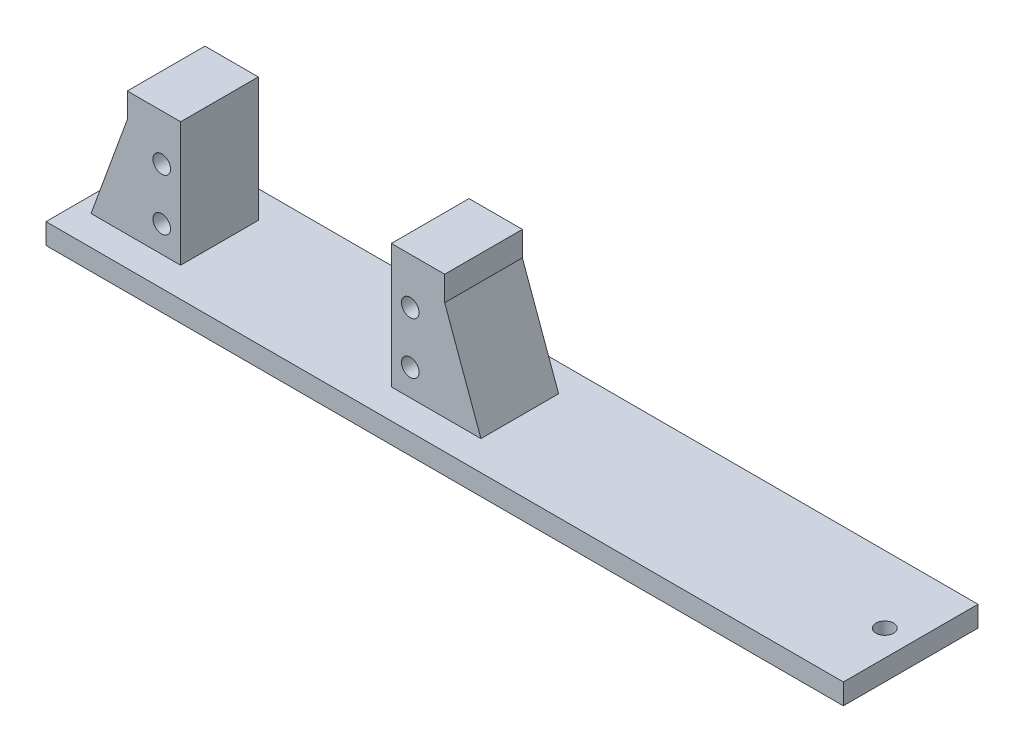
ISO-10303-21;
HEADER;
FILE_DESCRIPTION(('STEP AP214'),'2;1');
FILE_NAME('part.step','',(''),(''),'','','');
FILE_SCHEMA(('AUTOMOTIVE_DESIGN { 1 0 10303 214 1 1 1 1 }'));
ENDSEC;
DATA;
#1=APPLICATION_CONTEXT('core data for automotive mechanical design processes');
#2=APPLICATION_PROTOCOL_DEFINITION('international standard','automotive_design',2000,#1);
#3=PRODUCT_CONTEXT('',#1,'mechanical');
#4=PRODUCT('Part','Part','',(#3));
#5=PRODUCT_RELATED_PRODUCT_CATEGORY('part','',(#4));
#6=PRODUCT_DEFINITION_FORMATION('','',#4);
#7=PRODUCT_DEFINITION_CONTEXT('part definition',#1,'design');
#8=PRODUCT_DEFINITION('design','',#6,#7);
#9=PRODUCT_DEFINITION_SHAPE('','',#8);
#10=(LENGTH_UNIT() NAMED_UNIT(*) SI_UNIT(.MILLI.,.METRE.));
#11=(NAMED_UNIT(*) PLANE_ANGLE_UNIT() SI_UNIT($,.RADIAN.));
#12=(NAMED_UNIT(*) SI_UNIT($,.STERADIAN.) SOLID_ANGLE_UNIT());
#13=UNCERTAINTY_MEASURE_WITH_UNIT(LENGTH_MEASURE(1.E-05),#10,'distance_accuracy_value','');
#14=(GEOMETRIC_REPRESENTATION_CONTEXT(3) GLOBAL_UNCERTAINTY_ASSIGNED_CONTEXT((#13)) GLOBAL_UNIT_ASSIGNED_CONTEXT((#10,
#11,#12)) REPRESENTATION_CONTEXT('',''));
#15=CARTESIAN_POINT('',(0.,0.,0.));
#16=DIRECTION('',(0.,0.,1.));
#17=DIRECTION('',(1.,0.,0.));
#18=AXIS2_PLACEMENT_3D('',#15,#16,#17);
#19=CARTESIAN_POINT('',(-67.,23.2323419361827,-73.7));
#20=DIRECTION('',(-0.939692620785911,0.342020143325662,0.));
#21=DIRECTION('',(0.,0.,-1.));
#22=AXIS2_PLACEMENT_3D('',#19,#20,#21);
#23=PLANE('',#22);
#24=DIRECTION('',(0.,0.,-1.));
#25=VECTOR('',#24,1.);
#26=CARTESIAN_POINT('',(-74.,4.,-73.7));
#27=LINE('',#26,#25);
#28=CARTESIAN_POINT('',(-74.,4.,-71.));
#29=VERTEX_POINT('',#28);
#30=CARTESIAN_POINT('',(-74.,4.,-73.7));
#31=VERTEX_POINT('',#30);
#32=EDGE_CURVE('E298',#29,#31,#27,.T.);
#33=ORIENTED_EDGE('',*,*,#32,.F.);
#34=DIRECTION('',(-0.342020143325662,-0.939692620785911,0.));
#35=VECTOR('',#34,1.);
#36=CARTESIAN_POINT('',(-67.,23.2323419361827,-71.));
#37=LINE('',#36,#35);
#38=CARTESIAN_POINT('',(-67.,23.2323419361827,-71.));
#39=VERTEX_POINT('',#38);
#40=EDGE_CURVE('E11',#29,#39,#37,.F.);
#41=ORIENTED_EDGE('',*,*,#40,.T.);
#42=DIRECTION('',(0.,0.,1.));
#43=VECTOR('',#42,1.);
#44=CARTESIAN_POINT('',(-67.,23.2323419361827,-58.7));
#45=LINE('',#44,#43);
#46=CARTESIAN_POINT('',(-67.,23.2323419361827,-73.7));
#47=VERTEX_POINT('',#46);
#48=EDGE_CURVE('E296',#47,#39,#45,.T.);
#49=ORIENTED_EDGE('',*,*,#48,.F.);
#50=DIRECTION('',(-0.342020143325662,-0.939692620785911,0.));
#51=VECTOR('',#50,1.);
#52=CARTESIAN_POINT('',(-65.4677042346781,27.4422899513307,-73.7));
#53=LINE('',#52,#51);
#54=EDGE_CURVE('E302',#31,#47,#53,.F.);
#55=ORIENTED_EDGE('',*,*,#54,.F.);
#56=EDGE_LOOP('',(#33,#41,#49,#55));
#57=FACE_BOUND('',#56,.T.);
#58=ADVANCED_FACE('F43',(#57),#23,.T.);
#59=CARTESIAN_POINT('',(0.,4.,0.));
#60=DIRECTION('',(0.,-1.,0.));
#61=DIRECTION('',(0.,0.,-1.));
#62=AXIS2_PLACEMENT_3D('',#59,#60,#61);
#63=PLANE('',#62);
#64=DIRECTION('',(-1.,0.,0.));
#65=VECTOR('',#64,1.);
#66=CARTESIAN_POINT('',(-77.,4.,-71.));
#67=LINE('',#66,#65);
#68=CARTESIAN_POINT('',(-67.,4.,-71.));
#69=VERTEX_POINT('',#68);
#70=EDGE_CURVE('E173',#69,#29,#67,.T.);
#71=ORIENTED_EDGE('',*,*,#70,.T.);
#72=ORIENTED_EDGE('',*,*,#32,.T.);
#73=DIRECTION('',(-1.,0.,0.));
#74=VECTOR('',#73,1.);
#75=CARTESIAN_POINT('',(-67.,4.,-73.7));
#76=LINE('',#75,#74);
#77=CARTESIAN_POINT('',(-56.7,4.,-73.7));
#78=VERTEX_POINT('',#77);
#79=EDGE_CURVE('E231',#78,#31,#76,.T.);
#80=ORIENTED_EDGE('',*,*,#79,.F.);
#81=DIRECTION('',(0.,0.,-1.));
#82=VECTOR('',#81,1.);
#83=CARTESIAN_POINT('',(-56.7,4.,-73.7));
#84=LINE('',#83,#82);
#85=CARTESIAN_POINT('',(-56.7,4.,-58.7));
#86=VERTEX_POINT('',#85);
#87=EDGE_CURVE('E234',#86,#78,#84,.T.);
#88=ORIENTED_EDGE('',*,*,#87,.F.);
#89=DIRECTION('',(1.,0.,0.));
#90=VECTOR('',#89,1.);
#91=CARTESIAN_POINT('',(-67.,4.,-58.7));
#92=LINE('',#91,#90);
#93=CARTESIAN_POINT('',(-74.,4.,-58.7));
#94=VERTEX_POINT('',#93);
#95=EDGE_CURVE('E67',#94,#86,#92,.T.);
#96=ORIENTED_EDGE('',*,*,#95,.F.);
#97=CARTESIAN_POINT('',(-74.,3.99999999999999,-61.));
#98=VERTEX_POINT('',#97);
#99=EDGE_CURVE('E170',#94,#98,#27,.T.);
#100=ORIENTED_EDGE('',*,*,#99,.T.);
#101=DIRECTION('',(1.,0.,0.));
#102=VECTOR('',#101,1.);
#103=CARTESIAN_POINT('',(-77.,4.,-61.));
#104=LINE('',#103,#102);
#105=CARTESIAN_POINT('',(-67.,4.,-61.));
#106=VERTEX_POINT('',#105);
#107=EDGE_CURVE('E163',#98,#106,#104,.T.);
#108=ORIENTED_EDGE('',*,*,#107,.T.);
#109=DIRECTION('',(0.,0.,-1.));
#110=VECTOR('',#109,1.);
#111=CARTESIAN_POINT('',(-67.,4.,-71.));
#112=LINE('',#111,#110);
#113=EDGE_CURVE('E167',#106,#69,#112,.T.);
#114=ORIENTED_EDGE('',*,*,#113,.T.);
#115=EDGE_LOOP('',(#71,#72,#80,#88,#96,#100,#108,#114));
#116=FACE_BOUND('',#115,.T.);
#117=DIRECTION('',(0.,0.,1.));
#118=VECTOR('',#117,1.);
#119=CARTESIAN_POINT('',(-77.,4.,-79.));
#120=LINE('',#119,#118);
#121=CARTESIAN_POINT('',(-77.,4.,-79.));
#122=VERTEX_POINT('',#121);
#123=CARTESIAN_POINT('',(-77.,4.,-53.));
#124=VERTEX_POINT('',#123);
#125=EDGE_CURVE('E263',#122,#124,#120,.T.);
#126=ORIENTED_EDGE('',*,*,#125,.T.);
#127=DIRECTION('',(1.,0.,0.));
#128=VECTOR('',#127,1.);
#129=CARTESIAN_POINT('',(-77.,4.,-53.));
#130=LINE('',#129,#128);
#131=CARTESIAN_POINT('',(77.,4.,-53.));
#132=VERTEX_POINT('',#131);
#133=EDGE_CURVE('E255',#124,#132,#130,.T.);
#134=ORIENTED_EDGE('',*,*,#133,.T.);
#135=DIRECTION('',(0.,0.,-1.));
#136=VECTOR('',#135,1.);
#137=CARTESIAN_POINT('',(77.,4.,-79.));
#138=LINE('',#137,#136);
#139=CARTESIAN_POINT('',(77.,4.,-79.));
#140=VERTEX_POINT('',#139);
#141=EDGE_CURVE('E258',#132,#140,#138,.T.);
#142=ORIENTED_EDGE('',*,*,#141,.T.);
#143=DIRECTION('',(-1.,0.,0.));
#144=VECTOR('',#143,1.);
#145=CARTESIAN_POINT('',(-77.,4.,-79.));
#146=LINE('',#145,#144);
#147=EDGE_CURVE('E261',#140,#122,#146,.T.);
#148=ORIENTED_EDGE('',*,*,#147,.T.);
#149=EDGE_LOOP('',(#126,#134,#142,#148));
#150=FACE_BOUND('',#149,.T.);
#151=CARTESIAN_POINT('',(72.,4.,-66.));
#152=DIRECTION('',(0.,1.,0.));
#153=DIRECTION('',(0.,0.,1.));
#154=AXIS2_PLACEMENT_3D('',#151,#152,#153);
#155=CIRCLE('',#154,1.7);
#156=CARTESIAN_POINT('',(72.,4.,-64.3));
#157=VERTEX_POINT('',#156);
#158=EDGE_CURVE('E249',#157,#157,#155,.T.);
#159=ORIENTED_EDGE('',*,*,#158,.F.);
#160=EDGE_LOOP('',(#159));
#161=FACE_BOUND('',#160,.T.);
#162=DIRECTION('',(-1.,0.,0.));
#163=VECTOR('',#162,1.);
#164=CARTESIAN_POINT('',(-16.,4.,-73.7));
#165=LINE('',#164,#163);
#166=CARTESIAN_POINT('',(1.29999999999999,4.,-73.7));
#167=VERTEX_POINT('',#166);
#168=CARTESIAN_POINT('',(-16.,4.,-73.7));
#169=VERTEX_POINT('',#168);
#170=EDGE_CURVE('E202',#167,#169,#165,.T.);
#171=ORIENTED_EDGE('',*,*,#170,.F.);
#172=DIRECTION('',(0.,0.,1.));
#173=VECTOR('',#172,1.);
#174=CARTESIAN_POINT('',(1.3,4.,-58.7));
#175=LINE('',#174,#173);
#176=CARTESIAN_POINT('',(1.3,4.,-58.7));
#177=VERTEX_POINT('',#176);
#178=EDGE_CURVE('E287',#167,#177,#175,.T.);
#179=ORIENTED_EDGE('',*,*,#178,.T.);
#180=DIRECTION('',(1.,0.,0.));
#181=VECTOR('',#180,1.);
#182=CARTESIAN_POINT('',(-16.,4.,-58.7));
#183=LINE('',#182,#181);
#184=CARTESIAN_POINT('',(-16.,4.,-58.7));
#185=VERTEX_POINT('',#184);
#186=EDGE_CURVE('E200',#185,#177,#183,.T.);
#187=ORIENTED_EDGE('',*,*,#186,.F.);
#188=DIRECTION('',(0.,0.,1.));
#189=VECTOR('',#188,1.);
#190=CARTESIAN_POINT('',(-16.,4.,-73.7));
#191=LINE('',#190,#189);
#192=EDGE_CURVE('E193',#169,#185,#191,.T.);
#193=ORIENTED_EDGE('',*,*,#192,.F.);
#194=EDGE_LOOP('',(#171,#179,#187,#193));
#195=FACE_BOUND('',#194,.T.);
#196=CARTESIAN_POINT('',(-72.,4.,-66.));
#197=DIRECTION('',(0.,-1.,0.));
#198=DIRECTION('',(0.,0.,-1.));
#199=AXIS2_PLACEMENT_3D('',#196,#197,#198);
#200=CIRCLE('',#199,1.7);
#201=CARTESIAN_POINT('',(-72.,4.,-67.7));
#202=VERTEX_POINT('',#201);
#203=EDGE_CURVE('E185',#202,#202,#200,.T.);
#204=ORIENTED_EDGE('',*,*,#203,.T.);
#205=EDGE_LOOP('',(#204));
#206=FACE_BOUND('',#205,.T.);
#207=ADVANCED_FACE('F165',(#116,#150,#161,#195,#206),#63,.F.);
#208=CARTESIAN_POINT('',(0.,0.,0.));
#209=DIRECTION('',(0.,-1.,0.));
#210=DIRECTION('',(0.,0.,-1.));
#211=AXIS2_PLACEMENT_3D('',#208,#209,#210);
#212=PLANE('',#211);
#213=CARTESIAN_POINT('',(72.,0.,-66.));
#214=DIRECTION('',(0.,1.,0.));
#215=DIRECTION('',(0.,0.,1.));
#216=AXIS2_PLACEMENT_3D('',#213,#214,#215);
#217=CIRCLE('',#216,1.7);
#218=CARTESIAN_POINT('',(72.,0.,-64.3));
#219=VERTEX_POINT('',#218);
#220=EDGE_CURVE('E248',#219,#219,#217,.T.);
#221=ORIENTED_EDGE('',*,*,#220,.T.);
#222=EDGE_LOOP('',(#221));
#223=FACE_BOUND('',#222,.T.);
#224=DIRECTION('',(1.,0.,0.));
#225=VECTOR('',#224,1.);
#226=CARTESIAN_POINT('',(-77.,0.,-53.));
#227=LINE('',#226,#225);
#228=CARTESIAN_POINT('',(-77.,0.,-53.));
#229=VERTEX_POINT('',#228);
#230=CARTESIAN_POINT('',(77.,0.,-53.));
#231=VERTEX_POINT('',#230);
#232=EDGE_CURVE('E252',#229,#231,#227,.T.);
#233=ORIENTED_EDGE('',*,*,#232,.F.);
#234=DIRECTION('',(0.,0.,1.));
#235=VECTOR('',#234,1.);
#236=CARTESIAN_POINT('',(-77.,0.,-79.));
#237=LINE('',#236,#235);
#238=CARTESIAN_POINT('',(-77.,0.,-79.));
#239=VERTEX_POINT('',#238);
#240=EDGE_CURVE('E259',#239,#229,#237,.T.);
#241=ORIENTED_EDGE('',*,*,#240,.F.);
#242=DIRECTION('',(-1.,0.,0.));
#243=VECTOR('',#242,1.);
#244=CARTESIAN_POINT('',(-77.,0.,-79.));
#245=LINE('',#244,#243);
#246=CARTESIAN_POINT('',(77.,0.,-79.));
#247=VERTEX_POINT('',#246);
#248=EDGE_CURVE('E270',#247,#239,#245,.T.);
#249=ORIENTED_EDGE('',*,*,#248,.F.);
#250=DIRECTION('',(0.,0.,-1.));
#251=VECTOR('',#250,1.);
#252=CARTESIAN_POINT('',(77.,0.,-79.));
#253=LINE('',#252,#251);
#254=EDGE_CURVE('E268',#231,#247,#253,.T.);
#255=ORIENTED_EDGE('',*,*,#254,.F.);
#256=EDGE_LOOP('',(#233,#241,#249,#255));
#257=FACE_BOUND('',#256,.T.);
#258=CARTESIAN_POINT('',(-72.,0.,-66.));
#259=DIRECTION('',(0.,1.,0.));
#260=DIRECTION('',(0.,0.,1.));
#261=AXIS2_PLACEMENT_3D('',#258,#259,#260);
#262=CIRCLE('',#261,1.7);
#263=CARTESIAN_POINT('',(-72.,0.,-64.3));
#264=VERTEX_POINT('',#263);
#265=EDGE_CURVE('E218',#264,#264,#262,.T.);
#266=ORIENTED_EDGE('',*,*,#265,.T.);
#267=EDGE_LOOP('',(#266));
#268=FACE_BOUND('',#267,.T.);
#269=ADVANCED_FACE('F398',(#223,#257,#268),#212,.T.);
#270=CARTESIAN_POINT('',(-77.,4.,-53.));
#271=DIRECTION('',(0.,0.,-1.));
#272=DIRECTION('',(-1.,0.,0.));
#273=AXIS2_PLACEMENT_3D('',#270,#271,#272);
#274=PLANE('',#273);
#275=ORIENTED_EDGE('',*,*,#232,.T.);
#276=DIRECTION('',(0.,-1.,0.));
#277=VECTOR('',#276,1.);
#278=CARTESIAN_POINT('',(77.,4.,-53.));
#279=LINE('',#278,#277);
#280=EDGE_CURVE('E281',#132,#231,#279,.T.);
#281=ORIENTED_EDGE('',*,*,#280,.F.);
#282=ORIENTED_EDGE('',*,*,#133,.F.);
#283=DIRECTION('',(0.,-1.,0.));
#284=VECTOR('',#283,1.);
#285=CARTESIAN_POINT('',(-77.,4.,-53.));
#286=LINE('',#285,#284);
#287=EDGE_CURVE('E265',#124,#229,#286,.T.);
#288=ORIENTED_EDGE('',*,*,#287,.T.);
#289=EDGE_LOOP('',(#275,#281,#282,#288));
#290=FACE_BOUND('',#289,.T.);
#291=ADVANCED_FACE('F413',(#290),#274,.F.);
#292=CARTESIAN_POINT('',(77.,4.,-79.));
#293=DIRECTION('',(-1.,0.,0.));
#294=DIRECTION('',(0.,0.,1.));
#295=AXIS2_PLACEMENT_3D('',#292,#293,#294);
#296=PLANE('',#295);
#297=ORIENTED_EDGE('',*,*,#254,.T.);
#298=DIRECTION('',(0.,-1.,0.));
#299=VECTOR('',#298,1.);
#300=CARTESIAN_POINT('',(77.,4.,-79.));
#301=LINE('',#300,#299);
#302=EDGE_CURVE('E278',#140,#247,#301,.T.);
#303=ORIENTED_EDGE('',*,*,#302,.F.);
#304=ORIENTED_EDGE('',*,*,#141,.F.);
#305=ORIENTED_EDGE('',*,*,#280,.T.);
#306=EDGE_LOOP('',(#297,#303,#304,#305));
#307=FACE_BOUND('',#306,.T.);
#308=ADVANCED_FACE('F416',(#307),#296,.F.);
#309=CARTESIAN_POINT('',(-77.,4.,-79.));
#310=DIRECTION('',(0.,0.,1.));
#311=DIRECTION('',(1.,0.,0.));
#312=AXIS2_PLACEMENT_3D('',#309,#310,#311);
#313=PLANE('',#312);
#314=ORIENTED_EDGE('',*,*,#248,.T.);
#315=DIRECTION('',(0.,-1.,0.));
#316=VECTOR('',#315,1.);
#317=CARTESIAN_POINT('',(-77.,4.,-79.));
#318=LINE('',#317,#316);
#319=EDGE_CURVE('E275',#122,#239,#318,.T.);
#320=ORIENTED_EDGE('',*,*,#319,.F.);
#321=ORIENTED_EDGE('',*,*,#147,.F.);
#322=ORIENTED_EDGE('',*,*,#302,.T.);
#323=EDGE_LOOP('',(#314,#320,#321,#322));
#324=FACE_BOUND('',#323,.T.);
#325=ADVANCED_FACE('F420',(#324),#313,.F.);
#326=CARTESIAN_POINT('',(-77.,4.,-79.));
#327=DIRECTION('',(1.,0.,0.));
#328=DIRECTION('',(0.,0.,-1.));
#329=AXIS2_PLACEMENT_3D('',#326,#327,#328);
#330=PLANE('',#329);
#331=ORIENTED_EDGE('',*,*,#240,.T.);
#332=ORIENTED_EDGE('',*,*,#287,.F.);
#333=ORIENTED_EDGE('',*,*,#125,.F.);
#334=ORIENTED_EDGE('',*,*,#319,.T.);
#335=EDGE_LOOP('',(#331,#332,#333,#334));
#336=FACE_BOUND('',#335,.T.);
#337=ADVANCED_FACE('F424',(#336),#330,.F.);
#338=CARTESIAN_POINT('',(72.,4.,-66.));
#339=DIRECTION('',(0.,-1.,0.));
#340=DIRECTION('',(0.,0.,-1.));
#341=AXIS2_PLACEMENT_3D('',#338,#339,#340);
#342=CYLINDRICAL_SURFACE('',#341,1.7);
#343=ORIENTED_EDGE('',*,*,#158,.T.);
#344=EDGE_LOOP('',(#343));
#345=FACE_BOUND('',#344,.T.);
#346=ORIENTED_EDGE('',*,*,#220,.F.);
#347=EDGE_LOOP('',(#346));
#348=FACE_BOUND('',#347,.T.);
#349=ADVANCED_FACE('F428',(#345,#348),#342,.F.);
#350=CARTESIAN_POINT('',(-72.,4.,-66.));
#351=DIRECTION('',(0.,-1.,0.));
#352=DIRECTION('',(0.,0.,-1.));
#353=AXIS2_PLACEMENT_3D('',#350,#351,#352);
#354=CYLINDRICAL_SURFACE('',#353,1.7);
#355=ORIENTED_EDGE('',*,*,#203,.F.);
#356=EDGE_LOOP('',(#355));
#357=FACE_BOUND('',#356,.T.);
#358=ORIENTED_EDGE('',*,*,#265,.F.);
#359=EDGE_LOOP('',(#358));
#360=FACE_BOUND('',#359,.T.);
#361=ADVANCED_FACE('F435',(#357,#360),#354,.F.);
#362=CARTESIAN_POINT('',(-67.,28.,-58.7));
#363=DIRECTION('',(0.,0.,-1.));
#364=DIRECTION('',(-1.,0.,0.));
#365=AXIS2_PLACEMENT_3D('',#362,#363,#364);
#366=PLANE('',#365);
#367=CARTESIAN_POINT('',(-60.35,19.1,-58.7));
#368=DIRECTION('',(0.,0.,1.));
#369=DIRECTION('',(1.,0.,0.));
#370=AXIS2_PLACEMENT_3D('',#367,#368,#369);
#371=CIRCLE('',#370,1.7);
#372=CARTESIAN_POINT('',(-58.65,19.1,-58.7));
#373=VERTEX_POINT('',#372);
#374=EDGE_CURVE('E331',#373,#373,#371,.T.);
#375=ORIENTED_EDGE('',*,*,#374,.F.);
#376=EDGE_LOOP('',(#375));
#377=FACE_BOUND('',#376,.T.);
#378=CARTESIAN_POINT('',(-60.35,9.09999999999999,-58.7));
#379=DIRECTION('',(0.,0.,1.));
#380=DIRECTION('',(1.,0.,0.));
#381=AXIS2_PLACEMENT_3D('',#378,#379,#380);
#382=CIRCLE('',#381,1.7);
#383=CARTESIAN_POINT('',(-58.65,9.09999999999999,-58.7));
#384=VERTEX_POINT('',#383);
#385=EDGE_CURVE('E326',#384,#384,#382,.T.);
#386=ORIENTED_EDGE('',*,*,#385,.F.);
#387=EDGE_LOOP('',(#386));
#388=FACE_BOUND('',#387,.T.);
#389=ORIENTED_EDGE('',*,*,#95,.T.);
#390=DIRECTION('',(0.,-1.,0.));
#391=VECTOR('',#390,1.);
#392=CARTESIAN_POINT('',(-56.7,28.,-58.7));
#393=LINE('',#392,#391);
#394=CARTESIAN_POINT('',(-56.7,28.,-58.7));
#395=VERTEX_POINT('',#394);
#396=EDGE_CURVE('E188',#395,#86,#393,.T.);
#397=ORIENTED_EDGE('',*,*,#396,.F.);
#398=DIRECTION('',(1.,0.,0.));
#399=VECTOR('',#398,1.);
#400=CARTESIAN_POINT('',(-67.,28.,-58.7));
#401=LINE('',#400,#399);
#402=CARTESIAN_POINT('',(-67.,28.,-58.7));
#403=VERTEX_POINT('',#402);
#404=EDGE_CURVE('E235',#403,#395,#401,.T.);
#405=ORIENTED_EDGE('',*,*,#404,.F.);
#406=DIRECTION('',(0.,-1.,0.));
#407=VECTOR('',#406,1.);
#408=CARTESIAN_POINT('',(-67.,28.,-58.7));
#409=LINE('',#408,#407);
#410=CARTESIAN_POINT('',(-67.,23.2323419361827,-58.7));
#411=VERTEX_POINT('',#410);
#412=EDGE_CURVE('E227',#403,#411,#409,.T.);
#413=ORIENTED_EDGE('',*,*,#412,.T.);
#414=DIRECTION('',(0.342020143325662,0.939692620785911,0.));
#415=VECTOR('',#414,1.);
#416=CARTESIAN_POINT('',(-65.4677042346781,27.4422899513307,-58.7));
#417=LINE('',#416,#415);
#418=EDGE_CURVE('E300',#411,#94,#417,.F.);
#419=ORIENTED_EDGE('',*,*,#418,.T.);
#420=EDGE_LOOP('',(#389,#397,#405,#413,#419));
#421=FACE_BOUND('',#420,.T.);
#422=ADVANCED_FACE('F309',(#377,#388,#421),#366,.F.);
#423=CARTESIAN_POINT('',(-56.7,28.,-73.7));
#424=DIRECTION('',(-1.,0.,0.));
#425=DIRECTION('',(0.,0.,1.));
#426=AXIS2_PLACEMENT_3D('',#423,#424,#425);
#427=PLANE('',#426);
#428=ORIENTED_EDGE('',*,*,#87,.T.);
#429=DIRECTION('',(0.,-1.,0.));
#430=VECTOR('',#429,1.);
#431=CARTESIAN_POINT('',(-56.7,28.,-73.7));
#432=LINE('',#431,#430);
#433=CARTESIAN_POINT('',(-56.7,28.,-73.7));
#434=VERTEX_POINT('',#433);
#435=EDGE_CURVE('E221',#434,#78,#432,.T.);
#436=ORIENTED_EDGE('',*,*,#435,.F.);
#437=DIRECTION('',(0.,0.,-1.));
#438=VECTOR('',#437,1.);
#439=CARTESIAN_POINT('',(-56.7,28.,-73.7));
#440=LINE('',#439,#438);
#441=EDGE_CURVE('E242',#395,#434,#440,.T.);
#442=ORIENTED_EDGE('',*,*,#441,.F.);
#443=ORIENTED_EDGE('',*,*,#396,.T.);
#444=EDGE_LOOP('',(#428,#436,#442,#443));
#445=FACE_BOUND('',#444,.T.);
#446=ADVANCED_FACE('F443',(#445),#427,.F.);
#447=CARTESIAN_POINT('',(-67.,28.,-73.7));
#448=DIRECTION('',(0.,0.,1.));
#449=DIRECTION('',(1.,0.,0.));
#450=AXIS2_PLACEMENT_3D('',#447,#448,#449);
#451=PLANE('',#450);
#452=CARTESIAN_POINT('',(-60.35,19.1,-73.7));
#453=DIRECTION('',(0.,0.,1.));
#454=DIRECTION('',(1.,0.,0.));
#455=AXIS2_PLACEMENT_3D('',#452,#453,#454);
#456=CIRCLE('',#455,1.7);
#457=CARTESIAN_POINT('',(-58.65,19.1,-73.7));
#458=VERTEX_POINT('',#457);
#459=EDGE_CURVE('E335',#458,#458,#456,.F.);
#460=ORIENTED_EDGE('',*,*,#459,.F.);
#461=EDGE_LOOP('',(#460));
#462=FACE_BOUND('',#461,.T.);
#463=CARTESIAN_POINT('',(-60.35,9.09999999999999,-73.7));
#464=DIRECTION('',(0.,0.,1.));
#465=DIRECTION('',(1.,0.,0.));
#466=AXIS2_PLACEMENT_3D('',#463,#464,#465);
#467=CIRCLE('',#466,1.7);
#468=CARTESIAN_POINT('',(-58.65,9.09999999999999,-73.7));
#469=VERTEX_POINT('',#468);
#470=EDGE_CURVE('E323',#469,#469,#467,.F.);
#471=ORIENTED_EDGE('',*,*,#470,.F.);
#472=EDGE_LOOP('',(#471));
#473=FACE_BOUND('',#472,.T.);
#474=ORIENTED_EDGE('',*,*,#79,.T.);
#475=ORIENTED_EDGE('',*,*,#54,.T.);
#476=DIRECTION('',(0.,-1.,0.));
#477=VECTOR('',#476,1.);
#478=CARTESIAN_POINT('',(-67.,28.,-73.7));
#479=LINE('',#478,#477);
#480=CARTESIAN_POINT('',(-67.,28.,-73.7));
#481=VERTEX_POINT('',#480);
#482=EDGE_CURVE('E224',#481,#47,#479,.T.);
#483=ORIENTED_EDGE('',*,*,#482,.F.);
#484=DIRECTION('',(-1.,0.,0.));
#485=VECTOR('',#484,1.);
#486=CARTESIAN_POINT('',(-67.,28.,-73.7));
#487=LINE('',#486,#485);
#488=EDGE_CURVE('E240',#434,#481,#487,.T.);
#489=ORIENTED_EDGE('',*,*,#488,.F.);
#490=ORIENTED_EDGE('',*,*,#435,.T.);
#491=EDGE_LOOP('',(#474,#475,#483,#489,#490));
#492=FACE_BOUND('',#491,.T.);
#493=ADVANCED_FACE('F316',(#462,#473,#492),#451,.F.);
#494=CARTESIAN_POINT('',(-67.,28.,-73.7));
#495=DIRECTION('',(1.,0.,0.));
#496=DIRECTION('',(0.,0.,-1.));
#497=AXIS2_PLACEMENT_3D('',#494,#495,#496);
#498=PLANE('',#497);
#499=ORIENTED_EDGE('',*,*,#412,.F.);
#500=DIRECTION('',(0.,0.,1.));
#501=VECTOR('',#500,1.);
#502=CARTESIAN_POINT('',(-67.,28.,-73.7));
#503=LINE('',#502,#501);
#504=EDGE_CURVE('E230',#481,#403,#503,.T.);
#505=ORIENTED_EDGE('',*,*,#504,.F.);
#506=ORIENTED_EDGE('',*,*,#482,.T.);
#507=ORIENTED_EDGE('',*,*,#48,.T.);
#508=DIRECTION('',(0.,1.,0.));
#509=VECTOR('',#508,1.);
#510=CARTESIAN_POINT('',(-67.,-10.1421356237309,-71.));
#511=LINE('',#510,#509);
#512=EDGE_CURVE('E178',#69,#39,#511,.T.);
#513=ORIENTED_EDGE('',*,*,#512,.F.);
#514=ORIENTED_EDGE('',*,*,#113,.F.);
#515=DIRECTION('',(0.,1.,0.));
#516=VECTOR('',#515,1.);
#517=CARTESIAN_POINT('',(-67.,-10.1421356237309,-61.));
#518=LINE('',#517,#516);
#519=CARTESIAN_POINT('',(-67.,23.2323419361827,-61.));
#520=VERTEX_POINT('',#519);
#521=EDGE_CURVE('E59',#106,#520,#518,.T.);
#522=ORIENTED_EDGE('',*,*,#521,.T.);
#523=EDGE_CURVE('E295',#520,#411,#45,.T.);
#524=ORIENTED_EDGE('',*,*,#523,.T.);
#525=EDGE_LOOP('',(#499,#505,#506,#507,#513,#514,#522,#524));
#526=FACE_BOUND('',#525,.T.);
#527=ADVANCED_FACE('F176',(#526),#498,.F.);
#528=CARTESIAN_POINT('',(0.,28.,0.));
#529=DIRECTION('',(0.,-1.,0.));
#530=DIRECTION('',(0.,0.,-1.));
#531=AXIS2_PLACEMENT_3D('',#528,#529,#530);
#532=PLANE('',#531);
#533=ORIENTED_EDGE('',*,*,#404,.T.);
#534=ORIENTED_EDGE('',*,*,#441,.T.);
#535=ORIENTED_EDGE('',*,*,#488,.T.);
#536=ORIENTED_EDGE('',*,*,#504,.T.);
#537=EDGE_LOOP('',(#533,#534,#535,#536));
#538=FACE_BOUND('',#537,.T.);
#539=ADVANCED_FACE('F311',(#538),#532,.F.);
#540=CARTESIAN_POINT('',(-16.,28.,-58.7));
#541=DIRECTION('',(0.,0.,-1.));
#542=DIRECTION('',(-1.,0.,0.));
#543=AXIS2_PLACEMENT_3D('',#540,#541,#542);
#544=PLANE('',#543);
#545=CARTESIAN_POINT('',(-12.35,9.09999999999999,-58.7));
#546=DIRECTION('',(0.,0.,1.));
#547=DIRECTION('',(1.,0.,0.));
#548=AXIS2_PLACEMENT_3D('',#545,#546,#547);
#549=CIRCLE('',#548,1.7);
#550=CARTESIAN_POINT('',(-10.65,9.09999999999999,-58.7));
#551=VERTEX_POINT('',#550);
#552=EDGE_CURVE('E332',#551,#551,#549,.T.);
#553=ORIENTED_EDGE('',*,*,#552,.F.);
#554=EDGE_LOOP('',(#553));
#555=FACE_BOUND('',#554,.T.);
#556=CARTESIAN_POINT('',(-12.35,19.1,-58.7));
#557=DIRECTION('',(0.,0.,1.));
#558=DIRECTION('',(1.,0.,0.));
#559=AXIS2_PLACEMENT_3D('',#556,#557,#558);
#560=CIRCLE('',#559,1.7);
#561=CARTESIAN_POINT('',(-10.65,19.1,-58.7));
#562=VERTEX_POINT('',#561);
#563=EDGE_CURVE('E339',#562,#562,#560,.T.);
#564=ORIENTED_EDGE('',*,*,#563,.F.);
#565=EDGE_LOOP('',(#564));
#566=FACE_BOUND('',#565,.T.);
#567=ORIENTED_EDGE('',*,*,#186,.T.);
#568=DIRECTION('',(0.342020143325663,-0.939692620785911,0.));
#569=VECTOR('',#568,1.);
#570=CARTESIAN_POINT('',(-8.43716688325912,30.7526461412163,-58.7));
#571=LINE('',#570,#569);
#572=CARTESIAN_POINT('',(-5.69999999999999,23.2323419361827,-58.7));
#573=VERTEX_POINT('',#572);
#574=EDGE_CURVE('E293',#177,#573,#571,.F.);
#575=ORIENTED_EDGE('',*,*,#574,.T.);
#576=DIRECTION('',(0.,-1.,0.));
#577=VECTOR('',#576,1.);
#578=CARTESIAN_POINT('',(-5.69999999999999,28.,-58.7));
#579=LINE('',#578,#577);
#580=CARTESIAN_POINT('',(-5.69999999999999,28.,-58.7));
#581=VERTEX_POINT('',#580);
#582=EDGE_CURVE('E215',#581,#573,#579,.T.);
#583=ORIENTED_EDGE('',*,*,#582,.F.);
#584=DIRECTION('',(1.,0.,0.));
#585=VECTOR('',#584,1.);
#586=CARTESIAN_POINT('',(-16.,28.,-58.7));
#587=LINE('',#586,#585);
#588=CARTESIAN_POINT('',(-16.,28.,-58.7));
#589=VERTEX_POINT('',#588);
#590=EDGE_CURVE('E189',#589,#581,#587,.T.);
#591=ORIENTED_EDGE('',*,*,#590,.F.);
#592=DIRECTION('',(0.,-1.,0.));
#593=VECTOR('',#592,1.);
#594=CARTESIAN_POINT('',(-16.,28.,-58.7));
#595=LINE('',#594,#593);
#596=EDGE_CURVE('E199',#589,#185,#595,.T.);
#597=ORIENTED_EDGE('',*,*,#596,.T.);
#598=EDGE_LOOP('',(#567,#575,#583,#591,#597));
#599=FACE_BOUND('',#598,.T.);
#600=ADVANCED_FACE('F379',(#555,#566,#599),#544,.F.);
#601=CARTESIAN_POINT('',(-5.7,28.,-73.7));
#602=DIRECTION('',(-1.,0.,0.));
#603=DIRECTION('',(0.,0.,1.));
#604=AXIS2_PLACEMENT_3D('',#601,#602,#603);
#605=PLANE('',#604);
#606=ORIENTED_EDGE('',*,*,#582,.T.);
#607=DIRECTION('',(0.,0.,-1.));
#608=VECTOR('',#607,1.);
#609=CARTESIAN_POINT('',(-5.7,23.2323419361827,-73.7));
#610=LINE('',#609,#608);
#611=CARTESIAN_POINT('',(-5.7,23.2323419361827,-73.7));
#612=VERTEX_POINT('',#611);
#613=EDGE_CURVE('E284',#573,#612,#610,.T.);
#614=ORIENTED_EDGE('',*,*,#613,.T.);
#615=DIRECTION('',(0.,-1.,0.));
#616=VECTOR('',#615,1.);
#617=CARTESIAN_POINT('',(-5.7,28.,-73.7));
#618=LINE('',#617,#616);
#619=CARTESIAN_POINT('',(-5.7,28.,-73.7));
#620=VERTEX_POINT('',#619);
#621=EDGE_CURVE('E212',#620,#612,#618,.T.);
#622=ORIENTED_EDGE('',*,*,#621,.F.);
#623=DIRECTION('',(0.,0.,-1.));
#624=VECTOR('',#623,1.);
#625=CARTESIAN_POINT('',(-5.7,28.,-73.7));
#626=LINE('',#625,#624);
#627=EDGE_CURVE('E192',#581,#620,#626,.T.);
#628=ORIENTED_EDGE('',*,*,#627,.F.);
#629=EDGE_LOOP('',(#606,#614,#622,#628));
#630=FACE_BOUND('',#629,.T.);
#631=ADVANCED_FACE('F357',(#630),#605,.F.);
#632=CARTESIAN_POINT('',(-16.,28.,-73.7));
#633=DIRECTION('',(0.,0.,1.));
#634=DIRECTION('',(1.,0.,0.));
#635=AXIS2_PLACEMENT_3D('',#632,#633,#634);
#636=PLANE('',#635);
#637=CARTESIAN_POINT('',(-12.35,9.09999999999999,-73.7));
#638=DIRECTION('',(0.,0.,1.));
#639=DIRECTION('',(1.,0.,0.));
#640=AXIS2_PLACEMENT_3D('',#637,#638,#639);
#641=CIRCLE('',#640,1.7);
#642=CARTESIAN_POINT('',(-10.65,9.09999999999999,-73.7));
#643=VERTEX_POINT('',#642);
#644=EDGE_CURVE('E336',#643,#643,#641,.F.);
#645=ORIENTED_EDGE('',*,*,#644,.F.);
#646=EDGE_LOOP('',(#645));
#647=FACE_BOUND('',#646,.T.);
#648=CARTESIAN_POINT('',(-12.35,19.1,-73.7));
#649=DIRECTION('',(0.,0.,1.));
#650=DIRECTION('',(1.,0.,0.));
#651=AXIS2_PLACEMENT_3D('',#648,#649,#650);
#652=CIRCLE('',#651,1.7);
#653=CARTESIAN_POINT('',(-10.65,19.1,-73.7));
#654=VERTEX_POINT('',#653);
#655=EDGE_CURVE('E346',#654,#654,#652,.F.);
#656=ORIENTED_EDGE('',*,*,#655,.F.);
#657=EDGE_LOOP('',(#656));
#658=FACE_BOUND('',#657,.T.);
#659=ORIENTED_EDGE('',*,*,#170,.T.);
#660=DIRECTION('',(0.,-1.,0.));
#661=VECTOR('',#660,1.);
#662=CARTESIAN_POINT('',(-16.,28.,-73.7));
#663=LINE('',#662,#661);
#664=CARTESIAN_POINT('',(-16.,28.,-73.7));
#665=VERTEX_POINT('',#664);
#666=EDGE_CURVE('E209',#665,#169,#663,.T.);
#667=ORIENTED_EDGE('',*,*,#666,.F.);
#668=DIRECTION('',(-1.,0.,0.));
#669=VECTOR('',#668,1.);
#670=CARTESIAN_POINT('',(-16.,28.,-73.7));
#671=LINE('',#670,#669);
#672=EDGE_CURVE('E195',#620,#665,#671,.T.);
#673=ORIENTED_EDGE('',*,*,#672,.F.);
#674=ORIENTED_EDGE('',*,*,#621,.T.);
#675=DIRECTION('',(-0.342020143325663,0.939692620785911,0.));
#676=VECTOR('',#675,1.);
#677=CARTESIAN_POINT('',(-8.43716688325913,30.7526461412163,-73.7));
#678=LINE('',#677,#676);
#679=EDGE_CURVE('E290',#612,#167,#678,.F.);
#680=ORIENTED_EDGE('',*,*,#679,.T.);
#681=EDGE_LOOP('',(#659,#667,#673,#674,#680));
#682=FACE_BOUND('',#681,.T.);
#683=ADVANCED_FACE('F353',(#647,#658,#682),#636,.F.);
#684=CARTESIAN_POINT('',(-16.,28.,-73.7));
#685=DIRECTION('',(1.,0.,0.));
#686=DIRECTION('',(0.,0.,-1.));
#687=AXIS2_PLACEMENT_3D('',#684,#685,#686);
#688=PLANE('',#687);
#689=ORIENTED_EDGE('',*,*,#192,.T.);
#690=ORIENTED_EDGE('',*,*,#596,.F.);
#691=DIRECTION('',(0.,0.,1.));
#692=VECTOR('',#691,1.);
#693=CARTESIAN_POINT('',(-16.,28.,-73.7));
#694=LINE('',#693,#692);
#695=EDGE_CURVE('E197',#665,#589,#694,.T.);
#696=ORIENTED_EDGE('',*,*,#695,.F.);
#697=ORIENTED_EDGE('',*,*,#666,.T.);
#698=EDGE_LOOP('',(#689,#690,#696,#697));
#699=FACE_BOUND('',#698,.T.);
#700=ADVANCED_FACE('F356',(#699),#688,.F.);
#701=CARTESIAN_POINT('',(0.,28.,0.));
#702=DIRECTION('',(0.,-1.,0.));
#703=DIRECTION('',(0.,0.,-1.));
#704=AXIS2_PLACEMENT_3D('',#701,#702,#703);
#705=PLANE('',#704);
#706=ORIENTED_EDGE('',*,*,#590,.T.);
#707=ORIENTED_EDGE('',*,*,#627,.T.);
#708=ORIENTED_EDGE('',*,*,#672,.T.);
#709=ORIENTED_EDGE('',*,*,#695,.T.);
#710=EDGE_LOOP('',(#706,#707,#708,#709));
#711=FACE_BOUND('',#710,.T.);
#712=ADVANCED_FACE('F369',(#711),#705,.F.);
#713=CARTESIAN_POINT('',(-5.7,23.2323419361827,-73.7));
#714=DIRECTION('',(0.939692620785911,0.342020143325663,0.));
#715=DIRECTION('',(0.,0.,1.));
#716=AXIS2_PLACEMENT_3D('',#713,#714,#715);
#717=PLANE('',#716);
#718=ORIENTED_EDGE('',*,*,#574,.F.);
#719=ORIENTED_EDGE('',*,*,#178,.F.);
#720=ORIENTED_EDGE('',*,*,#679,.F.);
#721=ORIENTED_EDGE('',*,*,#613,.F.);
#722=EDGE_LOOP('',(#718,#719,#720,#721));
#723=FACE_BOUND('',#722,.T.);
#724=ADVANCED_FACE('F376',(#723),#717,.T.);
#725=ORIENTED_EDGE('',*,*,#523,.F.);
#726=DIRECTION('',(0.342020143325662,0.939692620785911,0.));
#727=VECTOR('',#726,1.);
#728=CARTESIAN_POINT('',(-67.,23.2323419361827,-61.));
#729=LINE('',#728,#727);
#730=EDGE_CURVE('E52',#520,#98,#729,.F.);
#731=ORIENTED_EDGE('',*,*,#730,.T.);
#732=ORIENTED_EDGE('',*,*,#99,.F.);
#733=ORIENTED_EDGE('',*,*,#418,.F.);
#734=EDGE_LOOP('',(#725,#731,#732,#733));
#735=FACE_BOUND('',#734,.T.);
#736=ADVANCED_FACE('F46',(#735),#23,.T.);
#737=CARTESIAN_POINT('',(-77.,-10.1421356237309,-71.));
#738=DIRECTION('',(0.,0.,-1.));
#739=DIRECTION('',(-1.,0.,0.));
#740=AXIS2_PLACEMENT_3D('',#737,#738,#739);
#741=PLANE('',#740);
#742=ORIENTED_EDGE('',*,*,#70,.F.);
#743=ORIENTED_EDGE('',*,*,#512,.T.);
#744=ORIENTED_EDGE('',*,*,#40,.F.);
#745=EDGE_LOOP('',(#742,#743,#744));
#746=FACE_BOUND('',#745,.T.);
#747=ADVANCED_FACE('F322',(#746),#741,.F.);
#748=CARTESIAN_POINT('',(-77.,-10.1421356237309,-61.));
#749=DIRECTION('',(0.,0.,1.));
#750=DIRECTION('',(1.,0.,0.));
#751=AXIS2_PLACEMENT_3D('',#748,#749,#750);
#752=PLANE('',#751);
#753=ORIENTED_EDGE('',*,*,#521,.F.);
#754=ORIENTED_EDGE('',*,*,#107,.F.);
#755=ORIENTED_EDGE('',*,*,#730,.F.);
#756=EDGE_LOOP('',(#753,#754,#755));
#757=FACE_BOUND('',#756,.T.);
#758=ADVANCED_FACE('F180',(#757),#752,.F.);
#759=CARTESIAN_POINT('',(-12.35,19.1,-78.5083261120685));
#760=DIRECTION('',(0.,0.,1.));
#761=DIRECTION('',(1.,0.,0.));
#762=AXIS2_PLACEMENT_3D('',#759,#760,#761);
#763=CYLINDRICAL_SURFACE('',#762,1.7);
#764=ORIENTED_EDGE('',*,*,#655,.T.);
#765=EDGE_LOOP('',(#764));
#766=FACE_BOUND('',#765,.T.);
#767=ORIENTED_EDGE('',*,*,#563,.T.);
#768=EDGE_LOOP('',(#767));
#769=FACE_BOUND('',#768,.T.);
#770=ADVANCED_FACE('F350',(#766,#769),#763,.F.);
#771=CARTESIAN_POINT('',(-12.35,9.09999999999999,-78.5083261120685));
#772=DIRECTION('',(0.,0.,1.));
#773=DIRECTION('',(1.,0.,0.));
#774=AXIS2_PLACEMENT_3D('',#771,#772,#773);
#775=CYLINDRICAL_SURFACE('',#774,1.7);
#776=ORIENTED_EDGE('',*,*,#644,.T.);
#777=EDGE_LOOP('',(#776));
#778=FACE_BOUND('',#777,.T.);
#779=ORIENTED_EDGE('',*,*,#552,.T.);
#780=EDGE_LOOP('',(#779));
#781=FACE_BOUND('',#780,.T.);
#782=ADVANCED_FACE('F459',(#778,#781),#775,.F.);
#783=CARTESIAN_POINT('',(-60.35,9.09999999999999,-78.5083261120685));
#784=DIRECTION('',(0.,0.,1.));
#785=DIRECTION('',(1.,0.,0.));
#786=AXIS2_PLACEMENT_3D('',#783,#784,#785);
#787=CYLINDRICAL_SURFACE('',#786,1.7);
#788=ORIENTED_EDGE('',*,*,#470,.T.);
#789=EDGE_LOOP('',(#788));
#790=FACE_BOUND('',#789,.T.);
#791=ORIENTED_EDGE('',*,*,#385,.T.);
#792=EDGE_LOOP('',(#791));
#793=FACE_BOUND('',#792,.T.);
#794=ADVANCED_FACE('F456',(#790,#793),#787,.F.);
#795=CARTESIAN_POINT('',(-60.35,19.1,-78.5083261120685));
#796=DIRECTION('',(0.,0.,1.));
#797=DIRECTION('',(1.,0.,0.));
#798=AXIS2_PLACEMENT_3D('',#795,#796,#797);
#799=CYLINDRICAL_SURFACE('',#798,1.7);
#800=ORIENTED_EDGE('',*,*,#459,.T.);
#801=EDGE_LOOP('',(#800));
#802=FACE_BOUND('',#801,.T.);
#803=ORIENTED_EDGE('',*,*,#374,.T.);
#804=EDGE_LOOP('',(#803));
#805=FACE_BOUND('',#804,.T.);
#806=ADVANCED_FACE('F458',(#802,#805),#799,.F.);
#807=CLOSED_SHELL('',(#58,#207,#269,#291,#308,#325,#337,#349,#361,#422,#446,#493,#527,#539,#600,
#631,#683,#700,#712,#724,#736,#747,#758,#770,#782,#794,#806));
#808=MANIFOLD_SOLID_BREP('B2',#807);
#809=ADVANCED_BREP_SHAPE_REPRESENTATION('',(#18,#808),#14);
#810=SHAPE_DEFINITION_REPRESENTATION(#9,#809);
ENDSEC;
END-ISO-10303-21;
